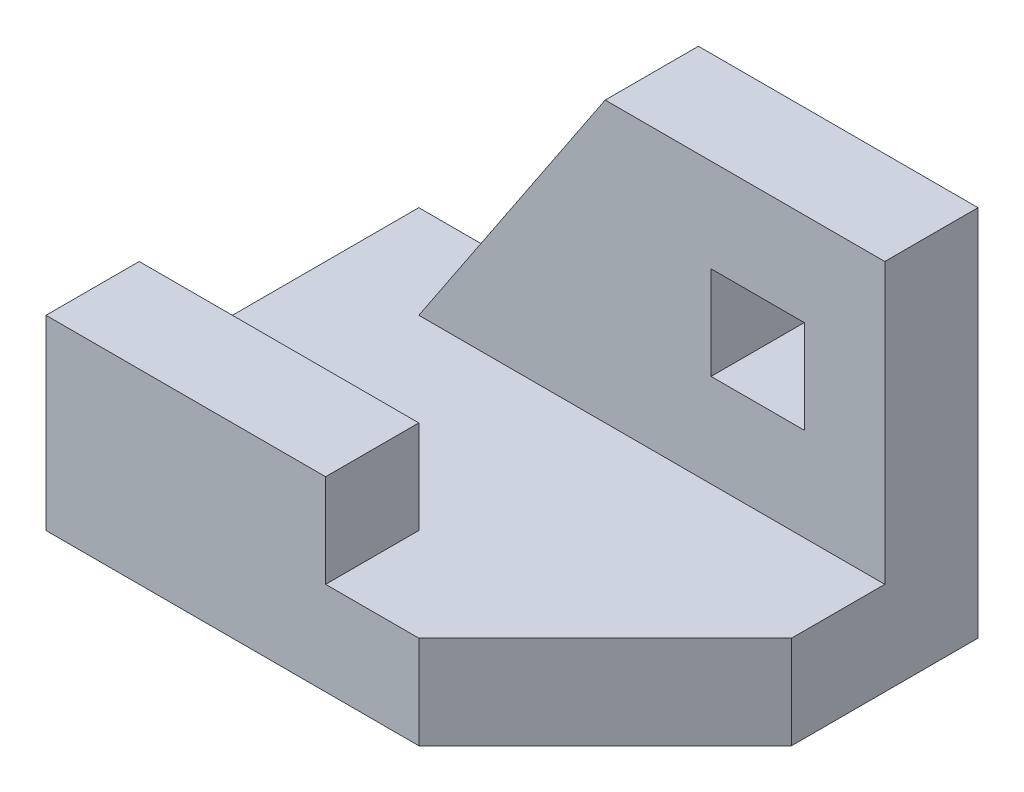
ISO-10303-21;
HEADER;
FILE_DESCRIPTION(('STEP AP214'),'2;1');
FILE_NAME('part.step','',(''),(''),'','','');
FILE_SCHEMA(('AUTOMOTIVE_DESIGN { 1 0 10303 214 1 1 1 1 }'));
ENDSEC;
DATA;
#1=APPLICATION_CONTEXT('core data for automotive mechanical design processes');
#2=APPLICATION_PROTOCOL_DEFINITION('international standard','automotive_design',2000,#1);
#3=PRODUCT_CONTEXT('',#1,'mechanical');
#4=PRODUCT('Part','Part','',(#3));
#5=PRODUCT_RELATED_PRODUCT_CATEGORY('part','',(#4));
#6=PRODUCT_DEFINITION_FORMATION('','',#4);
#7=PRODUCT_DEFINITION_CONTEXT('part definition',#1,'design');
#8=PRODUCT_DEFINITION('design','',#6,#7);
#9=PRODUCT_DEFINITION_SHAPE('','',#8);
#10=(LENGTH_UNIT() NAMED_UNIT(*) SI_UNIT(.MILLI.,.METRE.));
#11=(NAMED_UNIT(*) PLANE_ANGLE_UNIT() SI_UNIT($,.RADIAN.));
#12=(NAMED_UNIT(*) SI_UNIT($,.STERADIAN.) SOLID_ANGLE_UNIT());
#13=UNCERTAINTY_MEASURE_WITH_UNIT(LENGTH_MEASURE(1.E-05),#10,'distance_accuracy_value','');
#14=(GEOMETRIC_REPRESENTATION_CONTEXT(3) GLOBAL_UNCERTAINTY_ASSIGNED_CONTEXT((#13)) GLOBAL_UNIT_ASSIGNED_CONTEXT((#10,
#11,#12)) REPRESENTATION_CONTEXT('',''));
#15=CARTESIAN_POINT('',(0.,0.,0.));
#16=DIRECTION('',(0.,0.,1.));
#17=DIRECTION('',(1.,0.,0.));
#18=AXIS2_PLACEMENT_3D('',#15,#16,#17);
#19=CARTESIAN_POINT('',(-30.,10.,-20.));
#20=DIRECTION('',(0.,0.,-1.));
#21=DIRECTION('',(-1.,0.,0.));
#22=AXIS2_PLACEMENT_3D('',#19,#20,#21);
#23=PLANE('',#22);
#24=DIRECTION('',(1.,0.,0.));
#25=VECTOR('',#24,1.);
#26=CARTESIAN_POINT('',(-30.,0.,-20.));
#27=LINE('',#26,#25);
#28=CARTESIAN_POINT('',(-30.,0.,-20.));
#29=VERTEX_POINT('',#28);
#30=CARTESIAN_POINT('',(30.,0.,-20.));
#31=VERTEX_POINT('',#30);
#32=EDGE_CURVE('E270',#29,#31,#27,.T.);
#33=ORIENTED_EDGE('',*,*,#32,.F.);
#34=DIRECTION('',(0.,-1.,0.));
#35=VECTOR('',#34,1.);
#36=CARTESIAN_POINT('',(-30.,10.,-20.));
#37=LINE('',#36,#35);
#38=CARTESIAN_POINT('',(-30.,10.,-20.));
#39=VERTEX_POINT('',#38);
#40=EDGE_CURVE('E11',#39,#29,#37,.T.);
#41=ORIENTED_EDGE('',*,*,#40,.F.);
#42=DIRECTION('',(1.,0.,0.));
#43=VECTOR('',#42,1.);
#44=CARTESIAN_POINT('',(-30.,10.,-20.));
#45=LINE('',#44,#43);
#46=CARTESIAN_POINT('',(-20.,10.,-20.));
#47=VERTEX_POINT('',#46);
#48=EDGE_CURVE('E276',#39,#47,#45,.T.);
#49=ORIENTED_EDGE('',*,*,#48,.T.);
#50=DIRECTION('',(0.554700196225229,0.832050294337843,0.));
#51=VECTOR('',#50,1.);
#52=CARTESIAN_POINT('',(0.,40.,-20.));
#53=LINE('',#52,#51);
#54=CARTESIAN_POINT('',(0.,40.,-20.));
#55=VERTEX_POINT('',#54);
#56=EDGE_CURVE('E204',#47,#55,#53,.T.);
#57=ORIENTED_EDGE('',*,*,#56,.T.);
#58=DIRECTION('',(1.,0.,0.));
#59=VECTOR('',#58,1.);
#60=CARTESIAN_POINT('',(30.,40.,-20.));
#61=LINE('',#60,#59);
#62=CARTESIAN_POINT('',(30.,40.,-20.));
#63=VERTEX_POINT('',#62);
#64=EDGE_CURVE('E215',#55,#63,#61,.T.);
#65=ORIENTED_EDGE('',*,*,#64,.T.);
#66=DIRECTION('',(0.,-1.,0.));
#67=VECTOR('',#66,1.);
#68=CARTESIAN_POINT('',(30.,10.,-20.));
#69=LINE('',#68,#67);
#70=EDGE_CURVE('E42',#63,#31,#69,.T.);
#71=ORIENTED_EDGE('',*,*,#70,.T.);
#72=EDGE_LOOP('',(#33,#41,#49,#57,#65,#71));
#73=FACE_BOUND('',#72,.T.);
#74=DIRECTION('',(0.,-1.,0.));
#75=VECTOR('',#74,1.);
#76=CARTESIAN_POINT('',(21.3610067016228,20.,-20.));
#77=LINE('',#76,#75);
#78=CARTESIAN_POINT('',(21.3610067016228,30.,-20.));
#79=VERTEX_POINT('',#78);
#80=CARTESIAN_POINT('',(21.3610067016228,20.,-20.));
#81=VERTEX_POINT('',#80);
#82=EDGE_CURVE('E161',#79,#81,#77,.T.);
#83=ORIENTED_EDGE('',*,*,#82,.F.);
#84=DIRECTION('',(1.,0.,0.));
#85=VECTOR('',#84,1.);
#86=CARTESIAN_POINT('',(21.3610067016228,30.,-20.));
#87=LINE('',#86,#85);
#88=CARTESIAN_POINT('',(11.3610067016228,30.,-20.));
#89=VERTEX_POINT('',#88);
#90=EDGE_CURVE('E182',#89,#79,#87,.T.);
#91=ORIENTED_EDGE('',*,*,#90,.F.);
#92=DIRECTION('',(0.,1.,0.));
#93=VECTOR('',#92,1.);
#94=CARTESIAN_POINT('',(11.3610067016228,30.,-20.));
#95=LINE('',#94,#93);
#96=CARTESIAN_POINT('',(11.3610067016228,20.,-20.));
#97=VERTEX_POINT('',#96);
#98=EDGE_CURVE('E186',#97,#89,#95,.T.);
#99=ORIENTED_EDGE('',*,*,#98,.F.);
#100=DIRECTION('',(-1.,0.,0.));
#101=VECTOR('',#100,1.);
#102=CARTESIAN_POINT('',(11.3610067016228,20.,-20.));
#103=LINE('',#102,#101);
#104=EDGE_CURVE('E195',#81,#97,#103,.T.);
#105=ORIENTED_EDGE('',*,*,#104,.F.);
#106=EDGE_LOOP('',(#83,#91,#99,#105));
#107=FACE_BOUND('',#106,.T.);
#108=ADVANCED_FACE('F39',(#73,#107),#23,.T.);
#109=CARTESIAN_POINT('',(-30.,10.,-20.));
#110=DIRECTION('',(1.,0.,0.));
#111=DIRECTION('',(0.,0.,-1.));
#112=AXIS2_PLACEMENT_3D('',#109,#110,#111);
#113=PLANE('',#112);
#114=DIRECTION('',(0.,0.,1.));
#115=VECTOR('',#114,1.);
#116=CARTESIAN_POINT('',(-30.,0.,-20.));
#117=LINE('',#116,#115);
#118=CARTESIAN_POINT('',(-30.,0.,20.));
#119=VERTEX_POINT('',#118);
#120=EDGE_CURVE('E279',#29,#119,#117,.T.);
#121=ORIENTED_EDGE('',*,*,#120,.T.);
#122=DIRECTION('',(0.,-1.,0.));
#123=VECTOR('',#122,1.);
#124=CARTESIAN_POINT('',(-30.,10.,20.));
#125=LINE('',#124,#123);
#126=CARTESIAN_POINT('',(-30.,20.,20.));
#127=VERTEX_POINT('',#126);
#128=EDGE_CURVE('E48',#127,#119,#125,.T.);
#129=ORIENTED_EDGE('',*,*,#128,.F.);
#130=DIRECTION('',(0.,0.,1.));
#131=VECTOR('',#130,1.);
#132=CARTESIAN_POINT('',(-30.,20.,9.99999999999999));
#133=LINE('',#132,#131);
#134=CARTESIAN_POINT('',(-30.,20.,9.99999999999999));
#135=VERTEX_POINT('',#134);
#136=EDGE_CURVE('E266',#135,#127,#133,.T.);
#137=ORIENTED_EDGE('',*,*,#136,.F.);
#138=DIRECTION('',(0.,-1.,0.));
#139=VECTOR('',#138,1.);
#140=CARTESIAN_POINT('',(-30.,10.,9.99999999999999));
#141=LINE('',#140,#139);
#142=CARTESIAN_POINT('',(-30.,10.,9.99999999999999));
#143=VERTEX_POINT('',#142);
#144=EDGE_CURVE('E243',#135,#143,#141,.T.);
#145=ORIENTED_EDGE('',*,*,#144,.T.);
#146=DIRECTION('',(0.,0.,1.));
#147=VECTOR('',#146,1.);
#148=CARTESIAN_POINT('',(-30.,10.,-20.));
#149=LINE('',#148,#147);
#150=EDGE_CURVE('E289',#39,#143,#149,.T.);
#151=ORIENTED_EDGE('',*,*,#150,.F.);
#152=ORIENTED_EDGE('',*,*,#40,.T.);
#153=EDGE_LOOP('',(#121,#129,#137,#145,#151,#152));
#154=FACE_BOUND('',#153,.T.);
#155=ADVANCED_FACE('F326',(#154),#113,.F.);
#156=CARTESIAN_POINT('',(-30.,10.,20.));
#157=DIRECTION('',(0.,0.,-1.));
#158=DIRECTION('',(-1.,0.,0.));
#159=AXIS2_PLACEMENT_3D('',#156,#157,#158);
#160=PLANE('',#159);
#161=DIRECTION('',(1.,0.,0.));
#162=VECTOR('',#161,1.);
#163=CARTESIAN_POINT('',(-30.,0.,20.));
#164=LINE('',#163,#162);
#165=CARTESIAN_POINT('',(9.99999999999978,0.,20.));
#166=VERTEX_POINT('',#165);
#167=EDGE_CURVE('E304',#119,#166,#164,.T.);
#168=ORIENTED_EDGE('',*,*,#167,.T.);
#169=DIRECTION('',(0.,-1.,0.));
#170=VECTOR('',#169,1.);
#171=CARTESIAN_POINT('',(9.99999999999978,10.,20.));
#172=LINE('',#171,#170);
#173=CARTESIAN_POINT('',(9.99999999999978,10.,20.));
#174=VERTEX_POINT('',#173);
#175=EDGE_CURVE('E313',#174,#166,#172,.T.);
#176=ORIENTED_EDGE('',*,*,#175,.F.);
#177=DIRECTION('',(1.,0.,0.));
#178=VECTOR('',#177,1.);
#179=CARTESIAN_POINT('',(-30.,10.,20.));
#180=LINE('',#179,#178);
#181=CARTESIAN_POINT('',(0.,10.,20.));
#182=VERTEX_POINT('',#181);
#183=EDGE_CURVE('E286',#182,#174,#180,.T.);
#184=ORIENTED_EDGE('',*,*,#183,.F.);
#185=DIRECTION('',(0.,1.,0.));
#186=VECTOR('',#185,1.);
#187=CARTESIAN_POINT('',(0.,10.,20.));
#188=LINE('',#187,#186);
#189=CARTESIAN_POINT('',(0.,20.,20.));
#190=VERTEX_POINT('',#189);
#191=EDGE_CURVE('E56',#182,#190,#188,.T.);
#192=ORIENTED_EDGE('',*,*,#191,.T.);
#193=DIRECTION('',(-1.,0.,0.));
#194=VECTOR('',#193,1.);
#195=CARTESIAN_POINT('',(-30.,20.,20.));
#196=LINE('',#195,#194);
#197=EDGE_CURVE('E248',#190,#127,#196,.T.);
#198=ORIENTED_EDGE('',*,*,#197,.T.);
#199=ORIENTED_EDGE('',*,*,#128,.T.);
#200=EDGE_LOOP('',(#168,#176,#184,#192,#198,#199));
#201=FACE_BOUND('',#200,.T.);
#202=ADVANCED_FACE('F328',(#201),#160,.F.);
#203=CARTESIAN_POINT('',(30.,10.,0.));
#204=DIRECTION('',(0.707106781186544,0.,0.707106781186551));
#205=DIRECTION('',(0.707106781186551,0.,-0.707106781186544));
#206=AXIS2_PLACEMENT_3D('',#203,#204,#205);
#207=PLANE('',#206);
#208=DIRECTION('',(-0.707106781186551,0.,0.707106781186544));
#209=VECTOR('',#208,1.);
#210=CARTESIAN_POINT('',(30.,0.,0.));
#211=LINE('',#210,#209);
#212=CARTESIAN_POINT('',(30.,0.,0.));
#213=VERTEX_POINT('',#212);
#214=EDGE_CURVE('E300',#213,#166,#211,.T.);
#215=ORIENTED_EDGE('',*,*,#214,.F.);
#216=DIRECTION('',(0.,-1.,0.));
#217=VECTOR('',#216,1.);
#218=CARTESIAN_POINT('',(30.,10.,0.));
#219=LINE('',#218,#217);
#220=CARTESIAN_POINT('',(30.,10.,0.));
#221=VERTEX_POINT('',#220);
#222=EDGE_CURVE('E315',#221,#213,#219,.T.);
#223=ORIENTED_EDGE('',*,*,#222,.F.);
#224=DIRECTION('',(-0.707106781186551,0.,0.707106781186544));
#225=VECTOR('',#224,1.);
#226=CARTESIAN_POINT('',(30.,10.,0.));
#227=LINE('',#226,#225);
#228=EDGE_CURVE('E282',#221,#174,#227,.T.);
#229=ORIENTED_EDGE('',*,*,#228,.T.);
#230=ORIENTED_EDGE('',*,*,#175,.T.);
#231=EDGE_LOOP('',(#215,#223,#229,#230));
#232=FACE_BOUND('',#231,.T.);
#233=ADVANCED_FACE('F351',(#232),#207,.T.);
#234=CARTESIAN_POINT('',(30.,10.,-20.));
#235=DIRECTION('',(1.,0.,0.));
#236=DIRECTION('',(0.,0.,-1.));
#237=AXIS2_PLACEMENT_3D('',#234,#235,#236);
#238=PLANE('',#237);
#239=DIRECTION('',(0.,0.,1.));
#240=VECTOR('',#239,1.);
#241=CARTESIAN_POINT('',(30.,0.,-20.));
#242=LINE('',#241,#240);
#243=EDGE_CURVE('E296',#31,#213,#242,.T.);
#244=ORIENTED_EDGE('',*,*,#243,.F.);
#245=ORIENTED_EDGE('',*,*,#70,.F.);
#246=DIRECTION('',(0.,0.,-1.));
#247=VECTOR('',#246,1.);
#248=CARTESIAN_POINT('',(30.,40.,-10.));
#249=LINE('',#248,#247);
#250=CARTESIAN_POINT('',(30.,40.,-10.));
#251=VERTEX_POINT('',#250);
#252=EDGE_CURVE('E233',#251,#63,#249,.T.);
#253=ORIENTED_EDGE('',*,*,#252,.F.);
#254=DIRECTION('',(0.,-1.,0.));
#255=VECTOR('',#254,1.);
#256=CARTESIAN_POINT('',(30.,10.,-10.));
#257=LINE('',#256,#255);
#258=CARTESIAN_POINT('',(30.,10.,-10.));
#259=VERTEX_POINT('',#258);
#260=EDGE_CURVE('E223',#251,#259,#257,.T.);
#261=ORIENTED_EDGE('',*,*,#260,.T.);
#262=DIRECTION('',(0.,0.,1.));
#263=VECTOR('',#262,1.);
#264=CARTESIAN_POINT('',(30.,10.,-20.));
#265=LINE('',#264,#263);
#266=EDGE_CURVE('E89',#259,#221,#265,.T.);
#267=ORIENTED_EDGE('',*,*,#266,.T.);
#268=ORIENTED_EDGE('',*,*,#222,.T.);
#269=EDGE_LOOP('',(#244,#245,#253,#261,#267,#268));
#270=FACE_BOUND('',#269,.T.);
#271=ADVANCED_FACE('F322',(#270),#238,.T.);
#272=CARTESIAN_POINT('',(0.,10.,0.));
#273=DIRECTION('',(0.,-1.,0.));
#274=DIRECTION('',(0.,0.,-1.));
#275=AXIS2_PLACEMENT_3D('',#272,#273,#274);
#276=PLANE('',#275);
#277=DIRECTION('',(-1.,0.,0.));
#278=VECTOR('',#277,1.);
#279=CARTESIAN_POINT('',(30.,10.,-10.));
#280=LINE('',#279,#278);
#281=CARTESIAN_POINT('',(-20.,10.,-10.));
#282=VERTEX_POINT('',#281);
#283=EDGE_CURVE('E210',#259,#282,#280,.T.);
#284=ORIENTED_EDGE('',*,*,#283,.T.);
#285=DIRECTION('',(0.,0.,-1.));
#286=VECTOR('',#285,1.);
#287=CARTESIAN_POINT('',(-20.,10.,-10.));
#288=LINE('',#287,#286);
#289=EDGE_CURVE('E226',#282,#47,#288,.T.);
#290=ORIENTED_EDGE('',*,*,#289,.T.);
#291=ORIENTED_EDGE('',*,*,#48,.F.);
#292=ORIENTED_EDGE('',*,*,#150,.T.);
#293=DIRECTION('',(1.,0.,0.));
#294=VECTOR('',#293,1.);
#295=CARTESIAN_POINT('',(-30.,10.,9.99999999999999));
#296=LINE('',#295,#294);
#297=CARTESIAN_POINT('',(0.,10.,9.99999999999999));
#298=VERTEX_POINT('',#297);
#299=EDGE_CURVE('E247',#143,#298,#296,.T.);
#300=ORIENTED_EDGE('',*,*,#299,.T.);
#301=DIRECTION('',(0.,0.,1.));
#302=VECTOR('',#301,1.);
#303=CARTESIAN_POINT('',(0.,10.,9.99999999999999));
#304=LINE('',#303,#302);
#305=EDGE_CURVE('E260',#298,#182,#304,.T.);
#306=ORIENTED_EDGE('',*,*,#305,.T.);
#307=ORIENTED_EDGE('',*,*,#183,.T.);
#308=ORIENTED_EDGE('',*,*,#228,.F.);
#309=ORIENTED_EDGE('',*,*,#266,.F.);
#310=EDGE_LOOP('',(#284,#290,#291,#292,#300,#306,#307,#308,#309));
#311=FACE_BOUND('',#310,.T.);
#312=ADVANCED_FACE('F340',(#311),#276,.F.);
#313=CARTESIAN_POINT('',(0.,0.,0.));
#314=DIRECTION('',(0.,-1.,0.));
#315=DIRECTION('',(0.,0.,-1.));
#316=AXIS2_PLACEMENT_3D('',#313,#314,#315);
#317=PLANE('',#316);
#318=ORIENTED_EDGE('',*,*,#32,.T.);
#319=ORIENTED_EDGE('',*,*,#243,.T.);
#320=ORIENTED_EDGE('',*,*,#214,.T.);
#321=ORIENTED_EDGE('',*,*,#167,.F.);
#322=ORIENTED_EDGE('',*,*,#120,.F.);
#323=EDGE_LOOP('',(#318,#319,#320,#321,#322));
#324=FACE_BOUND('',#323,.T.);
#325=ADVANCED_FACE('F324',(#324),#317,.T.);
#326=CARTESIAN_POINT('',(-30.,20.,9.99999999999999));
#327=DIRECTION('',(0.,1.,0.));
#328=DIRECTION('',(0.,0.,1.));
#329=AXIS2_PLACEMENT_3D('',#326,#327,#328);
#330=PLANE('',#329);
#331=ORIENTED_EDGE('',*,*,#197,.F.);
#332=DIRECTION('',(0.,0.,1.));
#333=VECTOR('',#332,1.);
#334=CARTESIAN_POINT('',(0.,20.,9.99999999999999));
#335=LINE('',#334,#333);
#336=CARTESIAN_POINT('',(0.,20.,9.99999999999999));
#337=VERTEX_POINT('',#336);
#338=EDGE_CURVE('E271',#337,#190,#335,.T.);
#339=ORIENTED_EDGE('',*,*,#338,.F.);
#340=DIRECTION('',(-1.,0.,0.));
#341=VECTOR('',#340,1.);
#342=CARTESIAN_POINT('',(-30.,20.,9.99999999999999));
#343=LINE('',#342,#341);
#344=EDGE_CURVE('E256',#337,#135,#343,.T.);
#345=ORIENTED_EDGE('',*,*,#344,.T.);
#346=ORIENTED_EDGE('',*,*,#136,.T.);
#347=EDGE_LOOP('',(#331,#339,#345,#346));
#348=FACE_BOUND('',#347,.T.);
#349=ADVANCED_FACE('F333',(#348),#330,.T.);
#350=CARTESIAN_POINT('',(0.,10.,9.99999999999999));
#351=DIRECTION('',(1.,0.,0.));
#352=DIRECTION('',(0.,0.,-1.));
#353=AXIS2_PLACEMENT_3D('',#350,#351,#352);
#354=PLANE('',#353);
#355=ORIENTED_EDGE('',*,*,#191,.F.);
#356=ORIENTED_EDGE('',*,*,#305,.F.);
#357=DIRECTION('',(0.,1.,0.));
#358=VECTOR('',#357,1.);
#359=CARTESIAN_POINT('',(0.,10.,9.99999999999999));
#360=LINE('',#359,#358);
#361=EDGE_CURVE('E252',#298,#337,#360,.T.);
#362=ORIENTED_EDGE('',*,*,#361,.T.);
#363=ORIENTED_EDGE('',*,*,#338,.T.);
#364=EDGE_LOOP('',(#355,#356,#362,#363));
#365=FACE_BOUND('',#364,.T.);
#366=ADVANCED_FACE('F371',(#365),#354,.T.);
#367=CARTESIAN_POINT('',(0.,0.,9.99999999999999));
#368=DIRECTION('',(0.,0.,-1.));
#369=DIRECTION('',(-1.,0.,0.));
#370=AXIS2_PLACEMENT_3D('',#367,#368,#369);
#371=PLANE('',#370);
#372=ORIENTED_EDGE('',*,*,#144,.F.);
#373=ORIENTED_EDGE('',*,*,#344,.F.);
#374=ORIENTED_EDGE('',*,*,#361,.F.);
#375=ORIENTED_EDGE('',*,*,#299,.F.);
#376=EDGE_LOOP('',(#372,#373,#374,#375));
#377=FACE_BOUND('',#376,.T.);
#378=ADVANCED_FACE('F337',(#377),#371,.T.);
#379=CARTESIAN_POINT('',(30.,40.,-10.));
#380=DIRECTION('',(0.,1.,0.));
#381=DIRECTION('',(0.,0.,1.));
#382=AXIS2_PLACEMENT_3D('',#379,#380,#381);
#383=PLANE('',#382);
#384=ORIENTED_EDGE('',*,*,#64,.F.);
#385=DIRECTION('',(0.,0.,-1.));
#386=VECTOR('',#385,1.);
#387=CARTESIAN_POINT('',(0.,40.,-10.));
#388=LINE('',#387,#386);
#389=CARTESIAN_POINT('',(0.,40.,-10.));
#390=VERTEX_POINT('',#389);
#391=EDGE_CURVE('E237',#390,#55,#388,.T.);
#392=ORIENTED_EDGE('',*,*,#391,.F.);
#393=DIRECTION('',(1.,0.,0.));
#394=VECTOR('',#393,1.);
#395=CARTESIAN_POINT('',(30.,40.,-10.));
#396=LINE('',#395,#394);
#397=EDGE_CURVE('E219',#390,#251,#396,.T.);
#398=ORIENTED_EDGE('',*,*,#397,.T.);
#399=ORIENTED_EDGE('',*,*,#252,.T.);
#400=EDGE_LOOP('',(#384,#392,#398,#399));
#401=FACE_BOUND('',#400,.T.);
#402=ADVANCED_FACE('F347',(#401),#383,.T.);
#403=CARTESIAN_POINT('',(0.,40.,-10.));
#404=DIRECTION('',(-0.832050294337843,0.554700196225229,0.));
#405=DIRECTION('',(-0.554700196225229,-0.832050294337843,0.));
#406=AXIS2_PLACEMENT_3D('',#403,#404,#405);
#407=PLANE('',#406);
#408=ORIENTED_EDGE('',*,*,#56,.F.);
#409=ORIENTED_EDGE('',*,*,#289,.F.);
#410=DIRECTION('',(0.554700196225229,0.832050294337843,0.));
#411=VECTOR('',#410,1.);
#412=CARTESIAN_POINT('',(0.,40.,-10.));
#413=LINE('',#412,#411);
#414=EDGE_CURVE('E214',#282,#390,#413,.T.);
#415=ORIENTED_EDGE('',*,*,#414,.T.);
#416=ORIENTED_EDGE('',*,*,#391,.T.);
#417=EDGE_LOOP('',(#408,#409,#415,#416));
#418=FACE_BOUND('',#417,.T.);
#419=ADVANCED_FACE('F343',(#418),#407,.T.);
#420=CARTESIAN_POINT('',(0.,0.,-10.));
#421=DIRECTION('',(0.,0.,-1.));
#422=DIRECTION('',(-1.,0.,0.));
#423=AXIS2_PLACEMENT_3D('',#420,#421,#422);
#424=PLANE('',#423);
#425=DIRECTION('',(1.,0.,0.));
#426=VECTOR('',#425,1.);
#427=CARTESIAN_POINT('',(21.3610067016228,30.,-10.));
#428=LINE('',#427,#426);
#429=CARTESIAN_POINT('',(11.3610067016228,30.,-10.));
#430=VERTEX_POINT('',#429);
#431=CARTESIAN_POINT('',(21.3610067016228,30.,-10.));
#432=VERTEX_POINT('',#431);
#433=EDGE_CURVE('E167',#430,#432,#428,.T.);
#434=ORIENTED_EDGE('',*,*,#433,.T.);
#435=DIRECTION('',(0.,-1.,0.));
#436=VECTOR('',#435,1.);
#437=CARTESIAN_POINT('',(21.3610067016228,20.,-10.));
#438=LINE('',#437,#436);
#439=CARTESIAN_POINT('',(21.3610067016228,20.,-10.));
#440=VERTEX_POINT('',#439);
#441=EDGE_CURVE('E158',#432,#440,#438,.T.);
#442=ORIENTED_EDGE('',*,*,#441,.T.);
#443=DIRECTION('',(-1.,0.,0.));
#444=VECTOR('',#443,1.);
#445=CARTESIAN_POINT('',(11.3610067016228,20.,-10.));
#446=LINE('',#445,#444);
#447=CARTESIAN_POINT('',(11.3610067016228,20.,-10.));
#448=VERTEX_POINT('',#447);
#449=EDGE_CURVE('E171',#440,#448,#446,.T.);
#450=ORIENTED_EDGE('',*,*,#449,.T.);
#451=DIRECTION('',(0.,1.,0.));
#452=VECTOR('',#451,1.);
#453=CARTESIAN_POINT('',(11.3610067016228,30.,-10.));
#454=LINE('',#453,#452);
#455=EDGE_CURVE('E176',#448,#430,#454,.T.);
#456=ORIENTED_EDGE('',*,*,#455,.T.);
#457=EDGE_LOOP('',(#434,#442,#450,#456));
#458=FACE_BOUND('',#457,.T.);
#459=ORIENTED_EDGE('',*,*,#283,.F.);
#460=ORIENTED_EDGE('',*,*,#260,.F.);
#461=ORIENTED_EDGE('',*,*,#397,.F.);
#462=ORIENTED_EDGE('',*,*,#414,.F.);
#463=EDGE_LOOP('',(#459,#460,#461,#462));
#464=FACE_BOUND('',#463,.T.);
#465=ADVANCED_FACE('F178',(#458,#464),#424,.F.);
#466=CARTESIAN_POINT('',(21.3610067016228,20.,-10.));
#467=DIRECTION('',(1.,0.,0.));
#468=DIRECTION('',(0.,0.,-1.));
#469=AXIS2_PLACEMENT_3D('',#466,#467,#468);
#470=PLANE('',#469);
#471=ORIENTED_EDGE('',*,*,#82,.T.);
#472=DIRECTION('',(0.,0.,-1.));
#473=VECTOR('',#472,1.);
#474=CARTESIAN_POINT('',(21.3610067016228,20.,-10.));
#475=LINE('',#474,#473);
#476=EDGE_CURVE('E154',#440,#81,#475,.T.);
#477=ORIENTED_EDGE('',*,*,#476,.F.);
#478=ORIENTED_EDGE('',*,*,#441,.F.);
#479=DIRECTION('',(0.,0.,-1.));
#480=VECTOR('',#479,1.);
#481=CARTESIAN_POINT('',(21.3610067016228,30.,-10.));
#482=LINE('',#481,#480);
#483=EDGE_CURVE('E201',#432,#79,#482,.T.);
#484=ORIENTED_EDGE('',*,*,#483,.T.);
#485=EDGE_LOOP('',(#471,#477,#478,#484));
#486=FACE_BOUND('',#485,.T.);
#487=ADVANCED_FACE('F156',(#486),#470,.F.);
#488=CARTESIAN_POINT('',(21.3610067016228,30.,-10.));
#489=DIRECTION('',(0.,1.,0.));
#490=DIRECTION('',(0.,0.,1.));
#491=AXIS2_PLACEMENT_3D('',#488,#489,#490);
#492=PLANE('',#491);
#493=ORIENTED_EDGE('',*,*,#90,.T.);
#494=ORIENTED_EDGE('',*,*,#483,.F.);
#495=ORIENTED_EDGE('',*,*,#433,.F.);
#496=DIRECTION('',(0.,0.,-1.));
#497=VECTOR('',#496,1.);
#498=CARTESIAN_POINT('',(11.3610067016228,30.,-10.));
#499=LINE('',#498,#497);
#500=EDGE_CURVE('E205',#430,#89,#499,.T.);
#501=ORIENTED_EDGE('',*,*,#500,.T.);
#502=EDGE_LOOP('',(#493,#494,#495,#501));
#503=FACE_BOUND('',#502,.T.);
#504=ADVANCED_FACE('F386',(#503),#492,.F.);
#505=CARTESIAN_POINT('',(11.3610067016228,30.,-10.));
#506=DIRECTION('',(-1.,0.,0.));
#507=DIRECTION('',(0.,-1.,0.));
#508=AXIS2_PLACEMENT_3D('',#505,#506,#507);
#509=PLANE('',#508);
#510=ORIENTED_EDGE('',*,*,#98,.T.);
#511=ORIENTED_EDGE('',*,*,#500,.F.);
#512=ORIENTED_EDGE('',*,*,#455,.F.);
#513=DIRECTION('',(0.,0.,-1.));
#514=VECTOR('',#513,1.);
#515=CARTESIAN_POINT('',(11.3610067016228,20.,-10.));
#516=LINE('',#515,#514);
#517=EDGE_CURVE('E166',#448,#97,#516,.T.);
#518=ORIENTED_EDGE('',*,*,#517,.T.);
#519=EDGE_LOOP('',(#510,#511,#512,#518));
#520=FACE_BOUND('',#519,.T.);
#521=ADVANCED_FACE('F389',(#520),#509,.F.);
#522=CARTESIAN_POINT('',(11.3610067016228,20.,-10.));
#523=DIRECTION('',(0.,-1.,0.));
#524=DIRECTION('',(0.,0.,-1.));
#525=AXIS2_PLACEMENT_3D('',#522,#523,#524);
#526=PLANE('',#525);
#527=ORIENTED_EDGE('',*,*,#104,.T.);
#528=ORIENTED_EDGE('',*,*,#517,.F.);
#529=ORIENTED_EDGE('',*,*,#449,.F.);
#530=ORIENTED_EDGE('',*,*,#476,.T.);
#531=EDGE_LOOP('',(#527,#528,#529,#530));
#532=FACE_BOUND('',#531,.T.);
#533=ADVANCED_FACE('F172',(#532),#526,.F.);
#534=CLOSED_SHELL('',(#108,#155,#202,#233,#271,#312,#325,#349,#366,#378,#402,#419,#465,#487,
#504,#521,#533));
#535=MANIFOLD_SOLID_BREP('B2',#534);
#536=ADVANCED_BREP_SHAPE_REPRESENTATION('',(#18,#535),#14);
#537=SHAPE_DEFINITION_REPRESENTATION(#9,#536);
ENDSEC;
END-ISO-10303-21;
